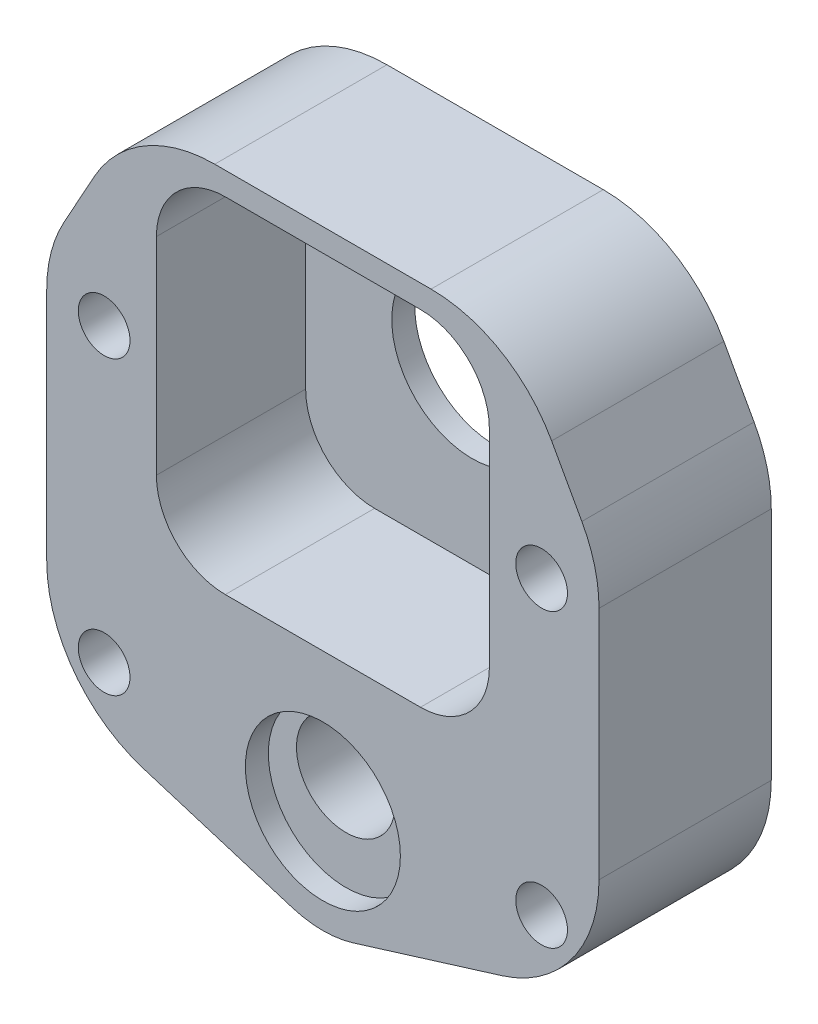
ISO-10303-21;
HEADER;
FILE_DESCRIPTION(('STEP AP214'),'2;1');
FILE_NAME('part.step','',(''),(''),'','','');
FILE_SCHEMA(('AUTOMOTIVE_DESIGN { 1 0 10303 214 1 1 1 1 }'));
ENDSEC;
DATA;
#1=APPLICATION_CONTEXT('core data for automotive mechanical design processes');
#2=APPLICATION_PROTOCOL_DEFINITION('international standard','automotive_design',2000,#1);
#3=PRODUCT_CONTEXT('',#1,'mechanical');
#4=PRODUCT('Part','Part','',(#3));
#5=PRODUCT_RELATED_PRODUCT_CATEGORY('part','',(#4));
#6=PRODUCT_DEFINITION_FORMATION('','',#4);
#7=PRODUCT_DEFINITION_CONTEXT('part definition',#1,'design');
#8=PRODUCT_DEFINITION('design','',#6,#7);
#9=PRODUCT_DEFINITION_SHAPE('','',#8);
#10=(LENGTH_UNIT() NAMED_UNIT(*) SI_UNIT(.MILLI.,.METRE.));
#11=(NAMED_UNIT(*) PLANE_ANGLE_UNIT() SI_UNIT($,.RADIAN.));
#12=(NAMED_UNIT(*) SI_UNIT($,.STERADIAN.) SOLID_ANGLE_UNIT());
#13=UNCERTAINTY_MEASURE_WITH_UNIT(LENGTH_MEASURE(1.E-05),#10,'distance_accuracy_value','');
#14=(GEOMETRIC_REPRESENTATION_CONTEXT(3) GLOBAL_UNCERTAINTY_ASSIGNED_CONTEXT((#13)) GLOBAL_UNIT_ASSIGNED_CONTEXT((#10,
#11,#12)) REPRESENTATION_CONTEXT('',''));
#15=CARTESIAN_POINT('',(0.,0.,0.));
#16=DIRECTION('',(0.,0.,1.));
#17=DIRECTION('',(1.,0.,0.));
#18=AXIS2_PLACEMENT_3D('',#15,#16,#17);
#19=CARTESIAN_POINT('',(0.,-25.4,15.));
#20=DIRECTION('',(0.,0.,-1.));
#21=DIRECTION('',(-1.,0.,0.));
#22=AXIS2_PLACEMENT_3D('',#19,#20,#21);
#23=CYLINDRICAL_SURFACE('',#22,4.3);
#24=CARTESIAN_POINT('',(0.,-25.4,0.));
#25=DIRECTION('',(0.,0.,1.));
#26=DIRECTION('',(1.,0.,0.));
#27=AXIS2_PLACEMENT_3D('',#24,#25,#26);
#28=CIRCLE('',#27,4.3);
#29=CARTESIAN_POINT('',(4.3,-25.4,0.));
#30=VERTEX_POINT('',#29);
#31=EDGE_CURVE('E213',#30,#30,#28,.T.);
#32=ORIENTED_EDGE('',*,*,#31,.F.);
#33=EDGE_LOOP('',(#32));
#34=FACE_BOUND('',#33,.T.);
#35=CARTESIAN_POINT('',(0.,-25.4,13.));
#36=DIRECTION('',(0.,0.,1.));
#37=DIRECTION('',(1.,0.,0.));
#38=AXIS2_PLACEMENT_3D('',#35,#36,#37);
#39=CIRCLE('',#38,4.3);
#40=CARTESIAN_POINT('',(4.3,-25.4,13.));
#41=VERTEX_POINT('',#40);
#42=EDGE_CURVE('E423',#41,#41,#39,.T.);
#43=ORIENTED_EDGE('',*,*,#42,.T.);
#44=EDGE_LOOP('',(#43));
#45=FACE_BOUND('',#44,.T.);
#46=ADVANCED_FACE('F47',(#34,#45),#23,.F.);
#47=CARTESIAN_POINT('',(0.,15.,15.));
#48=DIRECTION('',(0.,-1.,0.));
#49=DIRECTION('',(1.,0.,0.));
#50=AXIS2_PLACEMENT_3D('',#47,#48,#49);
#51=PLANE('',#50);
#52=DIRECTION('',(-1.,0.,0.));
#53=VECTOR('',#52,1.);
#54=CARTESIAN_POINT('',(0.,15.,15.));
#55=LINE('',#54,#53);
#56=CARTESIAN_POINT('',(8.49999999999999,15.,15.));
#57=VERTEX_POINT('',#56);
#58=CARTESIAN_POINT('',(-8.50000000000001,15.,15.));
#59=VERTEX_POINT('',#58);
#60=EDGE_CURVE('E490',#57,#59,#55,.T.);
#61=ORIENTED_EDGE('',*,*,#60,.T.);
#62=DIRECTION('',(0.,0.,-1.));
#63=VECTOR('',#62,1.);
#64=CARTESIAN_POINT('',(-8.50000000000001,15.,2.));
#65=LINE('',#64,#63);
#66=CARTESIAN_POINT('',(-8.50000000000001,15.,2.));
#67=VERTEX_POINT('',#66);
#68=EDGE_CURVE('E265',#59,#67,#65,.T.);
#69=ORIENTED_EDGE('',*,*,#68,.T.);
#70=DIRECTION('',(-1.,0.,0.));
#71=VECTOR('',#70,1.);
#72=CARTESIAN_POINT('',(0.,15.,2.));
#73=LINE('',#72,#71);
#74=CARTESIAN_POINT('',(8.49999999999999,15.,2.));
#75=VERTEX_POINT('',#74);
#76=EDGE_CURVE('E445',#75,#67,#73,.T.);
#77=ORIENTED_EDGE('',*,*,#76,.F.);
#78=DIRECTION('',(0.,0.,-1.));
#79=VECTOR('',#78,1.);
#80=CARTESIAN_POINT('',(8.49999999999999,15.,15.));
#81=LINE('',#80,#79);
#82=EDGE_CURVE('E262',#75,#57,#81,.F.);
#83=ORIENTED_EDGE('',*,*,#82,.T.);
#84=EDGE_LOOP('',(#61,#69,#77,#83));
#85=FACE_BOUND('',#84,.T.);
#86=ADVANCED_FACE('F419',(#85),#51,.T.);
#87=CARTESIAN_POINT('',(14.5,0.,15.));
#88=DIRECTION('',(1.,0.,0.));
#89=DIRECTION('',(0.,1.,0.));
#90=AXIS2_PLACEMENT_3D('',#87,#88,#89);
#91=PLANE('',#90);
#92=DIRECTION('',(0.,-1.,0.));
#93=VECTOR('',#92,1.);
#94=CARTESIAN_POINT('',(14.5,0.,15.));
#95=LINE('',#94,#93);
#96=CARTESIAN_POINT('',(14.5,9.,15.));
#97=VERTEX_POINT('',#96);
#98=CARTESIAN_POINT('',(14.5,-9.,15.));
#99=VERTEX_POINT('',#98);
#100=EDGE_CURVE('E494',#97,#99,#95,.T.);
#101=ORIENTED_EDGE('',*,*,#100,.F.);
#102=DIRECTION('',(0.,0.,-1.));
#103=VECTOR('',#102,1.);
#104=CARTESIAN_POINT('',(14.5,9.,15.));
#105=LINE('',#104,#103);
#106=CARTESIAN_POINT('',(14.5,9.,2.));
#107=VERTEX_POINT('',#106);
#108=EDGE_CURVE('E272',#97,#107,#105,.T.);
#109=ORIENTED_EDGE('',*,*,#108,.T.);
#110=DIRECTION('',(0.,-1.,0.));
#111=VECTOR('',#110,1.);
#112=CARTESIAN_POINT('',(14.5,0.,2.));
#113=LINE('',#112,#111);
#114=CARTESIAN_POINT('',(14.5,-9.,2.));
#115=VERTEX_POINT('',#114);
#116=EDGE_CURVE('E441',#107,#115,#113,.T.);
#117=ORIENTED_EDGE('',*,*,#116,.T.);
#118=DIRECTION('',(0.,0.,-1.));
#119=VECTOR('',#118,1.);
#120=CARTESIAN_POINT('',(14.5,-9.,15.));
#121=LINE('',#120,#119);
#122=EDGE_CURVE('E269',#115,#99,#121,.F.);
#123=ORIENTED_EDGE('',*,*,#122,.T.);
#124=EDGE_LOOP('',(#101,#109,#117,#123));
#125=FACE_BOUND('',#124,.T.);
#126=ADVANCED_FACE('F604',(#125),#91,.F.);
#127=CARTESIAN_POINT('',(0.,-15.,15.));
#128=DIRECTION('',(0.,-1.,0.));
#129=DIRECTION('',(1.,0.,0.));
#130=AXIS2_PLACEMENT_3D('',#127,#128,#129);
#131=PLANE('',#130);
#132=DIRECTION('',(-1.,0.,0.));
#133=VECTOR('',#132,1.);
#134=CARTESIAN_POINT('',(0.,-15.,2.));
#135=LINE('',#134,#133);
#136=CARTESIAN_POINT('',(8.5,-15.,2.));
#137=VERTEX_POINT('',#136);
#138=CARTESIAN_POINT('',(-8.5,-15.,2.));
#139=VERTEX_POINT('',#138);
#140=EDGE_CURVE('E453',#137,#139,#135,.T.);
#141=ORIENTED_EDGE('',*,*,#140,.T.);
#142=DIRECTION('',(0.,0.,-1.));
#143=VECTOR('',#142,1.);
#144=CARTESIAN_POINT('',(-8.5,-15.,15.));
#145=LINE('',#144,#143);
#146=CARTESIAN_POINT('',(-8.5,-15.,15.));
#147=VERTEX_POINT('',#146);
#148=EDGE_CURVE('E259',#139,#147,#145,.F.);
#149=ORIENTED_EDGE('',*,*,#148,.T.);
#150=DIRECTION('',(-1.,0.,0.));
#151=VECTOR('',#150,1.);
#152=CARTESIAN_POINT('',(0.,-15.,15.));
#153=LINE('',#152,#151);
#154=CARTESIAN_POINT('',(8.5,-15.,15.));
#155=VERTEX_POINT('',#154);
#156=EDGE_CURVE('E498',#155,#147,#153,.T.);
#157=ORIENTED_EDGE('',*,*,#156,.F.);
#158=DIRECTION('',(0.,0.,-1.));
#159=VECTOR('',#158,1.);
#160=CARTESIAN_POINT('',(8.5,-15.,2.));
#161=LINE('',#160,#159);
#162=EDGE_CURVE('E255',#155,#137,#161,.T.);
#163=ORIENTED_EDGE('',*,*,#162,.T.);
#164=EDGE_LOOP('',(#141,#149,#157,#163));
#165=FACE_BOUND('',#164,.T.);
#166=ADVANCED_FACE('F565',(#165),#131,.F.);
#167=CARTESIAN_POINT('',(-10.3013341487566,-33.3366902143089,15.));
#168=DIRECTION('',(0.295234753991785,0.955424743261033,0.));
#169=DIRECTION('',(-0.955424743261033,0.295234753991785,0.));
#170=AXIS2_PLACEMENT_3D('',#167,#168,#169);
#171=PLANE('',#170);
#172=DIRECTION('',(0.955424743261033,-0.295234753991785,0.));
#173=VECTOR('',#172,1.);
#174=CARTESIAN_POINT('',(-10.3013341487566,-33.3366902143089,15.));
#175=LINE('',#174,#173);
#176=CARTESIAN_POINT('',(-15.5928170479014,-31.7015748763404,15.));
#177=VERTEX_POINT('',#176);
#178=CARTESIAN_POINT('',(-2.65711278592607,-35.6988226893493,15.));
#179=VERTEX_POINT('',#178);
#180=EDGE_CURVE('E198',#177,#179,#175,.T.);
#181=ORIENTED_EDGE('',*,*,#180,.F.);
#182=DIRECTION('',(0.,0.,-1.));
#183=VECTOR('',#182,1.);
#184=CARTESIAN_POINT('',(-15.5928170479014,-31.7015748763404,15.));
#185=LINE('',#184,#183);
#186=CARTESIAN_POINT('',(-15.5928170479014,-31.7015748763404,0.));
#187=VERTEX_POINT('',#186);
#188=EDGE_CURVE('E339',#177,#187,#185,.T.);
#189=ORIENTED_EDGE('',*,*,#188,.T.);
#190=DIRECTION('',(0.955424743261033,-0.295234753991785,0.));
#191=VECTOR('',#190,1.);
#192=CARTESIAN_POINT('',(-10.3013341487566,-33.3366902143089,0.));
#193=LINE('',#192,#191);
#194=CARTESIAN_POINT('',(-2.65711278592607,-35.6988226893493,0.));
#195=VERTEX_POINT('',#194);
#196=EDGE_CURVE('E227',#187,#195,#193,.T.);
#197=ORIENTED_EDGE('',*,*,#196,.T.);
#198=DIRECTION('',(0.,0.,-1.));
#199=VECTOR('',#198,1.);
#200=CARTESIAN_POINT('',(-2.65711278592607,-35.6988226893493,15.));
#201=LINE('',#200,#199);
#202=EDGE_CURVE('E219',#179,#195,#201,.T.);
#203=ORIENTED_EDGE('',*,*,#202,.F.);
#204=EDGE_LOOP('',(#181,#189,#197,#203));
#205=FACE_BOUND('',#204,.T.);
#206=ADVANCED_FACE('F225',(#205),#171,.F.);
#207=CARTESIAN_POINT('',(0.,-27.1,15.));
#208=DIRECTION('',(0.,0.,-1.));
#209=DIRECTION('',(-1.,0.,0.));
#210=AXIS2_PLACEMENT_3D('',#207,#208,#209);
#211=CYLINDRICAL_SURFACE('',#210,9.);
#212=CARTESIAN_POINT('',(0.,-27.1,0.));
#213=DIRECTION('',(0.,0.,1.));
#214=DIRECTION('',(1.,0.,0.));
#215=AXIS2_PLACEMENT_3D('',#212,#213,#214);
#216=CIRCLE('',#215,9.);
#217=CARTESIAN_POINT('',(2.65711278592618,-35.6988226893493,0.));
#218=VERTEX_POINT('',#217);
#219=EDGE_CURVE('E507',#195,#218,#216,.T.);
#220=ORIENTED_EDGE('',*,*,#219,.T.);
#221=DIRECTION('',(0.,0.,-1.));
#222=VECTOR('',#221,1.);
#223=CARTESIAN_POINT('',(2.65711278592618,-35.6988226893493,15.));
#224=LINE('',#223,#222);
#225=CARTESIAN_POINT('',(2.65711278592618,-35.6988226893493,15.));
#226=VERTEX_POINT('',#225);
#227=EDGE_CURVE('E221',#226,#218,#224,.T.);
#228=ORIENTED_EDGE('',*,*,#227,.F.);
#229=CARTESIAN_POINT('',(0.,-27.1,15.));
#230=DIRECTION('',(0.,0.,1.));
#231=DIRECTION('',(1.,0.,0.));
#232=AXIS2_PLACEMENT_3D('',#229,#230,#231);
#233=CIRCLE('',#232,9.);
#234=EDGE_CURVE('E204',#179,#226,#233,.T.);
#235=ORIENTED_EDGE('',*,*,#234,.F.);
#236=ORIENTED_EDGE('',*,*,#202,.T.);
#237=EDGE_LOOP('',(#220,#228,#235,#236));
#238=FACE_BOUND('',#237,.T.);
#239=ADVANCED_FACE('F218',(#238),#211,.T.);
#240=CARTESIAN_POINT('',(10.301334148757,-33.3366902143087,15.));
#241=DIRECTION('',(0.295234753991798,-0.955424743261029,0.));
#242=DIRECTION('',(0.955424743261029,0.295234753991798,0.));
#243=AXIS2_PLACEMENT_3D('',#240,#241,#242);
#244=PLANE('',#243);
#245=DIRECTION('',(-0.955424743261029,-0.295234753991798,0.));
#246=VECTOR('',#245,1.);
#247=CARTESIAN_POINT('',(10.301334148757,-33.3366902143087,0.));
#248=LINE('',#247,#246);
#249=CARTESIAN_POINT('',(15.5928170479016,-31.7015748763401,0.));
#250=VERTEX_POINT('',#249);
#251=EDGE_CURVE('E510',#250,#218,#248,.T.);
#252=ORIENTED_EDGE('',*,*,#251,.F.);
#253=DIRECTION('',(0.,0.,-1.));
#254=VECTOR('',#253,1.);
#255=CARTESIAN_POINT('',(15.5928170479016,-31.7015748763401,15.));
#256=LINE('',#255,#254);
#257=CARTESIAN_POINT('',(15.5928170479016,-31.7015748763401,15.));
#258=VERTEX_POINT('',#257);
#259=EDGE_CURVE('E336',#250,#258,#256,.F.);
#260=ORIENTED_EDGE('',*,*,#259,.T.);
#261=DIRECTION('',(-0.955424743261029,-0.295234753991798,0.));
#262=VECTOR('',#261,1.);
#263=CARTESIAN_POINT('',(10.301334148757,-33.3366902143087,15.));
#264=LINE('',#263,#262);
#265=EDGE_CURVE('E223',#258,#226,#264,.T.);
#266=ORIENTED_EDGE('',*,*,#265,.T.);
#267=ORIENTED_EDGE('',*,*,#227,.T.);
#268=EDGE_LOOP('',(#252,#260,#266,#267));
#269=FACE_BOUND('',#268,.T.);
#270=ADVANCED_FACE('F568',(#269),#244,.T.);
#271=CARTESIAN_POINT('',(24.05,0.,15.));
#272=DIRECTION('',(1.,0.,0.));
#273=DIRECTION('',(0.,1.,0.));
#274=AXIS2_PLACEMENT_3D('',#271,#272,#273);
#275=PLANE('',#274);
#276=DIRECTION('',(0.,-1.,0.));
#277=VECTOR('',#276,1.);
#278=CARTESIAN_POINT('',(24.05,0.,0.));
#279=LINE('',#278,#277);
#280=CARTESIAN_POINT('',(24.05,0.239084913491565,0.));
#281=VERTEX_POINT('',#280);
#282=CARTESIAN_POINT('',(24.05,-20.2364779572078,0.));
#283=VERTEX_POINT('',#282);
#284=EDGE_CURVE('E513',#281,#283,#279,.T.);
#285=ORIENTED_EDGE('',*,*,#284,.F.);
#286=DIRECTION('',(0.,0.,-1.));
#287=VECTOR('',#286,1.);
#288=CARTESIAN_POINT('',(24.05,0.239084913491565,15.));
#289=LINE('',#288,#287);
#290=CARTESIAN_POINT('',(24.05,0.239084913491565,15.));
#291=VERTEX_POINT('',#290);
#292=EDGE_CURVE('E317',#281,#291,#289,.F.);
#293=ORIENTED_EDGE('',*,*,#292,.T.);
#294=DIRECTION('',(0.,-1.,0.));
#295=VECTOR('',#294,1.);
#296=CARTESIAN_POINT('',(24.05,0.,15.));
#297=LINE('',#296,#295);
#298=CARTESIAN_POINT('',(24.05,-20.2364779572078,15.));
#299=VERTEX_POINT('',#298);
#300=EDGE_CURVE('E462',#291,#299,#297,.T.);
#301=ORIENTED_EDGE('',*,*,#300,.T.);
#302=DIRECTION('',(0.,0.,-1.));
#303=VECTOR('',#302,1.);
#304=CARTESIAN_POINT('',(24.05,-20.2364779572078,15.));
#305=LINE('',#304,#303);
#306=EDGE_CURVE('E313',#299,#283,#305,.T.);
#307=ORIENTED_EDGE('',*,*,#306,.T.);
#308=EDGE_LOOP('',(#285,#293,#301,#307));
#309=FACE_BOUND('',#308,.T.);
#310=ADVANCED_FACE('F571',(#309),#275,.T.);
#311=CARTESIAN_POINT('',(19.8373307475197,10.9589156446664,15.));
#312=DIRECTION('',(0.875312878327595,0.483556992539515,0.));
#313=DIRECTION('',(-0.483556992539515,0.875312878327595,0.));
#314=AXIS2_PLACEMENT_3D('',#311,#312,#313);
#315=PLANE('',#314);
#316=DIRECTION('',(0.483556992539515,-0.875312878327595,0.));
#317=VECTOR('',#316,1.);
#318=CARTESIAN_POINT('',(19.8373307475197,10.9589156446664,15.));
#319=LINE('',#318,#317);
#320=CARTESIAN_POINT('',(19.9236392543356,10.8026839104742,15.));
#321=VERTEX_POINT('',#320);
#322=CARTESIAN_POINT('',(22.5537545399311,6.04176882396574,15.));
#323=VERTEX_POINT('',#322);
#324=EDGE_CURVE('E372',#321,#323,#319,.T.);
#325=ORIENTED_EDGE('',*,*,#324,.T.);
#326=DIRECTION('',(0.,0.,-1.));
#327=VECTOR('',#326,1.);
#328=CARTESIAN_POINT('',(22.5537545399311,6.04176882396574,15.));
#329=LINE('',#328,#327);
#330=CARTESIAN_POINT('',(22.5537545399311,6.04176882396574,0.));
#331=VERTEX_POINT('',#330);
#332=EDGE_CURVE('E291',#323,#331,#329,.T.);
#333=ORIENTED_EDGE('',*,*,#332,.T.);
#334=DIRECTION('',(0.483556992539515,-0.875312878327595,0.));
#335=VECTOR('',#334,1.);
#336=CARTESIAN_POINT('',(19.8373307475197,10.9589156446664,0.));
#337=LINE('',#336,#335);
#338=CARTESIAN_POINT('',(19.9236392543356,10.8026839104742,0.));
#339=VERTEX_POINT('',#338);
#340=EDGE_CURVE('E393',#339,#331,#337,.T.);
#341=ORIENTED_EDGE('',*,*,#340,.F.);
#342=DIRECTION('',(0.,0.,-1.));
#343=VECTOR('',#342,1.);
#344=CARTESIAN_POINT('',(19.9236392543356,10.8026839104742,15.));
#345=LINE('',#344,#343);
#346=EDGE_CURVE('E288',#339,#321,#345,.F.);
#347=ORIENTED_EDGE('',*,*,#346,.T.);
#348=EDGE_LOOP('',(#325,#333,#341,#347));
#349=FACE_BOUND('',#348,.T.);
#350=ADVANCED_FACE('F521',(#349),#315,.T.);
#351=CARTESIAN_POINT('',(0.,17.,15.));
#352=DIRECTION('',(0.,1.,0.));
#353=DIRECTION('',(0.,0.,1.));
#354=AXIS2_PLACEMENT_3D('',#351,#352,#353);
#355=PLANE('',#354);
#356=DIRECTION('',(1.,0.,0.));
#357=VECTOR('',#356,1.);
#358=CARTESIAN_POINT('',(0.,17.,15.));
#359=LINE('',#358,#357);
#360=CARTESIAN_POINT('',(-9.41988471440439,17.,15.));
#361=VERTEX_POINT('',#360);
#362=CARTESIAN_POINT('',(9.41988471440447,17.,15.));
#363=VERTEX_POINT('',#362);
#364=EDGE_CURVE('E361',#361,#363,#359,.T.);
#365=ORIENTED_EDGE('',*,*,#364,.T.);
#366=DIRECTION('',(0.,0.,-1.));
#367=VECTOR('',#366,1.);
#368=CARTESIAN_POINT('',(9.41988471440447,17.,15.));
#369=LINE('',#368,#367);
#370=CARTESIAN_POINT('',(9.41988471440447,17.,0.));
#371=VERTEX_POINT('',#370);
#372=EDGE_CURVE('E12',#363,#371,#369,.T.);
#373=ORIENTED_EDGE('',*,*,#372,.T.);
#374=DIRECTION('',(1.,0.,0.));
#375=VECTOR('',#374,1.);
#376=CARTESIAN_POINT('',(0.,17.,0.));
#377=LINE('',#376,#375);
#378=CARTESIAN_POINT('',(-9.41988471440439,17.,0.));
#379=VERTEX_POINT('',#378);
#380=EDGE_CURVE('E364',#379,#371,#377,.T.);
#381=ORIENTED_EDGE('',*,*,#380,.F.);
#382=DIRECTION('',(0.,0.,-1.));
#383=VECTOR('',#382,1.);
#384=CARTESIAN_POINT('',(-9.41988471440439,17.,15.));
#385=LINE('',#384,#383);
#386=EDGE_CURVE('E56',#379,#361,#385,.F.);
#387=ORIENTED_EDGE('',*,*,#386,.T.);
#388=EDGE_LOOP('',(#365,#373,#381,#387));
#389=FACE_BOUND('',#388,.T.);
#390=ADVANCED_FACE('F360',(#389),#355,.T.);
#391=CARTESIAN_POINT('',(-19.8373307475197,10.9589156446661,15.));
#392=DIRECTION('',(0.875312878327601,-0.483556992539505,0.));
#393=DIRECTION('',(0.483556992539505,0.875312878327601,0.));
#394=AXIS2_PLACEMENT_3D('',#391,#392,#393);
#395=PLANE('',#394);
#396=DIRECTION('',(-0.483556992539505,-0.875312878327601,0.));
#397=VECTOR('',#396,1.);
#398=CARTESIAN_POINT('',(-19.8373307475197,10.9589156446661,0.));
#399=LINE('',#398,#397);
#400=CARTESIAN_POINT('',(-19.9236392543356,10.8026839104741,0.));
#401=VERTEX_POINT('',#400);
#402=CARTESIAN_POINT('',(-22.5537545399312,6.04176882396533,0.));
#403=VERTEX_POINT('',#402);
#404=EDGE_CURVE('E379',#401,#403,#399,.T.);
#405=ORIENTED_EDGE('',*,*,#404,.T.);
#406=DIRECTION('',(0.,0.,-1.));
#407=VECTOR('',#406,1.);
#408=CARTESIAN_POINT('',(-22.5537545399312,6.04176882396533,15.));
#409=LINE('',#408,#407);
#410=CARTESIAN_POINT('',(-22.5537545399312,6.04176882396533,15.));
#411=VERTEX_POINT('',#410);
#412=EDGE_CURVE('E352',#403,#411,#409,.F.);
#413=ORIENTED_EDGE('',*,*,#412,.T.);
#414=DIRECTION('',(-0.483556992539505,-0.875312878327601,0.));
#415=VECTOR('',#414,1.);
#416=CARTESIAN_POINT('',(-19.8373307475197,10.9589156446661,15.));
#417=LINE('',#416,#415);
#418=CARTESIAN_POINT('',(-19.9236392543356,10.8026839104741,15.));
#419=VERTEX_POINT('',#418);
#420=EDGE_CURVE('E371',#419,#411,#417,.T.);
#421=ORIENTED_EDGE('',*,*,#420,.F.);
#422=DIRECTION('',(0.,0.,-1.));
#423=VECTOR('',#422,1.);
#424=CARTESIAN_POINT('',(-19.9236392543356,10.8026839104741,0.));
#425=LINE('',#424,#423);
#426=EDGE_CURVE('E348',#419,#401,#425,.T.);
#427=ORIENTED_EDGE('',*,*,#426,.T.);
#428=EDGE_LOOP('',(#405,#413,#421,#427));
#429=FACE_BOUND('',#428,.T.);
#430=ADVANCED_FACE('F378',(#429),#395,.F.);
#431=CARTESIAN_POINT('',(-14.5,0.,15.));
#432=DIRECTION('',(1.,0.,0.));
#433=DIRECTION('',(0.,1.,0.));
#434=AXIS2_PLACEMENT_3D('',#431,#432,#433);
#435=PLANE('',#434);
#436=DIRECTION('',(0.,-1.,0.));
#437=VECTOR('',#436,1.);
#438=CARTESIAN_POINT('',(-14.5,0.,15.));
#439=LINE('',#438,#437);
#440=CARTESIAN_POINT('',(-14.5,9.,15.));
#441=VERTEX_POINT('',#440);
#442=CARTESIAN_POINT('',(-14.5,-9.00000000000001,15.));
#443=VERTEX_POINT('',#442);
#444=EDGE_CURVE('E236',#441,#443,#439,.T.);
#445=ORIENTED_EDGE('',*,*,#444,.T.);
#446=DIRECTION('',(0.,0.,-1.));
#447=VECTOR('',#446,1.);
#448=CARTESIAN_POINT('',(-14.5,-9.00000000000001,15.));
#449=LINE('',#448,#447);
#450=CARTESIAN_POINT('',(-14.5,-9.00000000000001,2.));
#451=VERTEX_POINT('',#450);
#452=EDGE_CURVE('E234',#443,#451,#449,.T.);
#453=ORIENTED_EDGE('',*,*,#452,.T.);
#454=DIRECTION('',(0.,-1.,0.));
#455=VECTOR('',#454,1.);
#456=CARTESIAN_POINT('',(-14.5,0.,2.));
#457=LINE('',#456,#455);
#458=CARTESIAN_POINT('',(-14.5,9.,2.));
#459=VERTEX_POINT('',#458);
#460=EDGE_CURVE('E449',#459,#451,#457,.T.);
#461=ORIENTED_EDGE('',*,*,#460,.F.);
#462=DIRECTION('',(0.,0.,-1.));
#463=VECTOR('',#462,1.);
#464=CARTESIAN_POINT('',(-14.5,9.,15.));
#465=LINE('',#464,#463);
#466=EDGE_CURVE('E230',#459,#441,#465,.F.);
#467=ORIENTED_EDGE('',*,*,#466,.T.);
#468=EDGE_LOOP('',(#445,#453,#461,#467));
#469=FACE_BOUND('',#468,.T.);
#470=ADVANCED_FACE('F582',(#469),#435,.T.);
#471=CARTESIAN_POINT('',(19.05,0.,15.));
#472=DIRECTION('',(0.,0.,-1.));
#473=DIRECTION('',(-1.,0.,0.));
#474=AXIS2_PLACEMENT_3D('',#471,#472,#473);
#475=CYLINDRICAL_SURFACE('',#474,2.25);
#476=CARTESIAN_POINT('',(19.05,0.,15.));
#477=DIRECTION('',(0.,0.,1.));
#478=DIRECTION('',(1.,0.,0.));
#479=AXIS2_PLACEMENT_3D('',#476,#477,#478);
#480=CIRCLE('',#479,2.25);
#481=CARTESIAN_POINT('',(21.3,0.,15.));
#482=VERTEX_POINT('',#481);
#483=EDGE_CURVE('E486',#482,#482,#480,.T.);
#484=ORIENTED_EDGE('',*,*,#483,.T.);
#485=EDGE_LOOP('',(#484));
#486=FACE_BOUND('',#485,.T.);
#487=CARTESIAN_POINT('',(19.05,0.,0.));
#488=DIRECTION('',(0.,0.,1.));
#489=DIRECTION('',(1.,0.,0.));
#490=AXIS2_PLACEMENT_3D('',#487,#488,#489);
#491=CIRCLE('',#490,2.25);
#492=CARTESIAN_POINT('',(21.3,0.,0.));
#493=VERTEX_POINT('',#492);
#494=EDGE_CURVE('E408',#493,#493,#491,.T.);
#495=ORIENTED_EDGE('',*,*,#494,.F.);
#496=EDGE_LOOP('',(#495));
#497=FACE_BOUND('',#496,.T.);
#498=ADVANCED_FACE('F597',(#486,#497),#475,.F.);
#499=CARTESIAN_POINT('',(-19.05,-2.66050878019847E-13,15.));
#500=DIRECTION('',(0.,0.,-1.));
#501=DIRECTION('',(-1.,0.,0.));
#502=AXIS2_PLACEMENT_3D('',#499,#500,#501);
#503=CYLINDRICAL_SURFACE('',#502,2.25);
#504=CARTESIAN_POINT('',(-19.05,-2.66050878019847E-13,15.));
#505=DIRECTION('',(0.,0.,1.));
#506=DIRECTION('',(1.,0.,0.));
#507=AXIS2_PLACEMENT_3D('',#504,#505,#506);
#508=CIRCLE('',#507,2.25);
#509=CARTESIAN_POINT('',(-16.8,-2.66050878019847E-13,15.));
#510=VERTEX_POINT('',#509);
#511=EDGE_CURVE('E482',#510,#510,#508,.T.);
#512=ORIENTED_EDGE('',*,*,#511,.T.);
#513=EDGE_LOOP('',(#512));
#514=FACE_BOUND('',#513,.T.);
#515=CARTESIAN_POINT('',(-19.05,-2.66050878019847E-13,0.));
#516=DIRECTION('',(0.,0.,1.));
#517=DIRECTION('',(1.,0.,0.));
#518=AXIS2_PLACEMENT_3D('',#515,#516,#517);
#519=CIRCLE('',#518,2.25);
#520=CARTESIAN_POINT('',(-16.8,-2.66050878019847E-13,0.));
#521=VERTEX_POINT('',#520);
#522=EDGE_CURVE('E404',#521,#521,#519,.T.);
#523=ORIENTED_EDGE('',*,*,#522,.F.);
#524=EDGE_LOOP('',(#523));
#525=FACE_BOUND('',#524,.T.);
#526=ADVANCED_FACE('F593',(#514,#525),#503,.F.);
#527=CARTESIAN_POINT('',(-19.05,-25.4000000000003,15.));
#528=DIRECTION('',(0.,0.,-1.));
#529=DIRECTION('',(-1.,0.,0.));
#530=AXIS2_PLACEMENT_3D('',#527,#528,#529);
#531=CYLINDRICAL_SURFACE('',#530,2.25);
#532=CARTESIAN_POINT('',(-19.05,-25.4000000000003,15.));
#533=DIRECTION('',(0.,0.,1.));
#534=DIRECTION('',(1.,0.,0.));
#535=AXIS2_PLACEMENT_3D('',#532,#533,#534);
#536=CIRCLE('',#535,2.25);
#537=CARTESIAN_POINT('',(-16.8,-25.4000000000003,15.));
#538=VERTEX_POINT('',#537);
#539=EDGE_CURVE('E478',#538,#538,#536,.T.);
#540=ORIENTED_EDGE('',*,*,#539,.T.);
#541=EDGE_LOOP('',(#540));
#542=FACE_BOUND('',#541,.T.);
#543=CARTESIAN_POINT('',(-19.05,-25.4000000000003,0.));
#544=DIRECTION('',(0.,0.,1.));
#545=DIRECTION('',(1.,0.,0.));
#546=AXIS2_PLACEMENT_3D('',#543,#544,#545);
#547=CIRCLE('',#546,2.25);
#548=CARTESIAN_POINT('',(-16.8,-25.4000000000003,0.));
#549=VERTEX_POINT('',#548);
#550=EDGE_CURVE('E400',#549,#549,#547,.T.);
#551=ORIENTED_EDGE('',*,*,#550,.F.);
#552=EDGE_LOOP('',(#551));
#553=FACE_BOUND('',#552,.T.);
#554=ADVANCED_FACE('F589',(#542,#553),#531,.F.);
#555=CARTESIAN_POINT('',(19.05,-25.4,15.));
#556=DIRECTION('',(0.,0.,-1.));
#557=DIRECTION('',(-1.,0.,0.));
#558=AXIS2_PLACEMENT_3D('',#555,#556,#557);
#559=CYLINDRICAL_SURFACE('',#558,2.25);
#560=CARTESIAN_POINT('',(19.05,-25.4,15.));
#561=DIRECTION('',(0.,0.,1.));
#562=DIRECTION('',(1.,0.,0.));
#563=AXIS2_PLACEMENT_3D('',#560,#561,#562);
#564=CIRCLE('',#563,2.25);
#565=CARTESIAN_POINT('',(21.3,-25.4,15.));
#566=VERTEX_POINT('',#565);
#567=EDGE_CURVE('E474',#566,#566,#564,.T.);
#568=ORIENTED_EDGE('',*,*,#567,.T.);
#569=EDGE_LOOP('',(#568));
#570=FACE_BOUND('',#569,.T.);
#571=CARTESIAN_POINT('',(19.05,-25.4,0.));
#572=DIRECTION('',(0.,0.,1.));
#573=DIRECTION('',(1.,0.,0.));
#574=AXIS2_PLACEMENT_3D('',#571,#572,#573);
#575=CIRCLE('',#574,2.25);
#576=CARTESIAN_POINT('',(21.3,-25.4,0.));
#577=VERTEX_POINT('',#576);
#578=EDGE_CURVE('E391',#577,#577,#575,.T.);
#579=ORIENTED_EDGE('',*,*,#578,.F.);
#580=EDGE_LOOP('',(#579));
#581=FACE_BOUND('',#580,.T.);
#582=ADVANCED_FACE('F586',(#570,#581),#559,.F.);
#583=CARTESIAN_POINT('',(-24.05,0.,15.));
#584=DIRECTION('',(1.,0.,0.));
#585=DIRECTION('',(0.,1.,0.));
#586=AXIS2_PLACEMENT_3D('',#583,#584,#585);
#587=PLANE('',#586);
#588=DIRECTION('',(0.,-1.,0.));
#589=VECTOR('',#588,1.);
#590=CARTESIAN_POINT('',(-24.05,0.,0.));
#591=LINE('',#590,#589);
#592=CARTESIAN_POINT('',(-24.05,0.239084913491271,0.));
#593=VERTEX_POINT('',#592);
#594=CARTESIAN_POINT('',(-24.05,-20.236477957208,0.));
#595=VERTEX_POINT('',#594);
#596=EDGE_CURVE('E387',#593,#595,#591,.T.);
#597=ORIENTED_EDGE('',*,*,#596,.T.);
#598=DIRECTION('',(0.,0.,-1.));
#599=VECTOR('',#598,1.);
#600=CARTESIAN_POINT('',(-24.05,-20.236477957208,15.));
#601=LINE('',#600,#599);
#602=CARTESIAN_POINT('',(-24.05,-20.236477957208,15.));
#603=VERTEX_POINT('',#602);
#604=EDGE_CURVE('E63',#595,#603,#601,.F.);
#605=ORIENTED_EDGE('',*,*,#604,.T.);
#606=DIRECTION('',(0.,-1.,0.));
#607=VECTOR('',#606,1.);
#608=CARTESIAN_POINT('',(-24.05,0.,15.));
#609=LINE('',#608,#607);
#610=CARTESIAN_POINT('',(-24.05,0.239084913491271,15.));
#611=VERTEX_POINT('',#610);
#612=EDGE_CURVE('E471',#611,#603,#609,.T.);
#613=ORIENTED_EDGE('',*,*,#612,.F.);
#614=DIRECTION('',(0.,0.,-1.));
#615=VECTOR('',#614,1.);
#616=CARTESIAN_POINT('',(-24.05,0.239084913491271,15.));
#617=LINE('',#616,#615);
#618=EDGE_CURVE('E342',#611,#593,#617,.T.);
#619=ORIENTED_EDGE('',*,*,#618,.T.);
#620=EDGE_LOOP('',(#597,#605,#613,#619));
#621=FACE_BOUND('',#620,.T.);
#622=ADVANCED_FACE('F583',(#621),#587,.F.);
#623=CARTESIAN_POINT('',(0.,0.,15.));
#624=DIRECTION('',(0.,0.,1.));
#625=DIRECTION('',(1.,0.,0.));
#626=AXIS2_PLACEMENT_3D('',#623,#624,#625);
#627=PLANE('',#626);
#628=CARTESIAN_POINT('',(0.,-27.1,15.));
#629=DIRECTION('',(0.,0.,1.));
#630=DIRECTION('',(1.,0.,0.));
#631=AXIS2_PLACEMENT_3D('',#628,#629,#630);
#632=CIRCLE('',#631,6.75);
#633=CARTESIAN_POINT('',(6.75,-27.1,15.));
#634=VERTEX_POINT('',#633);
#635=EDGE_CURVE('E426',#634,#634,#632,.T.);
#636=ORIENTED_EDGE('',*,*,#635,.F.);
#637=EDGE_LOOP('',(#636));
#638=FACE_BOUND('',#637,.T.);
#639=ORIENTED_EDGE('',*,*,#300,.F.);
#640=CARTESIAN_POINT('',(12.05,0.239084913491562,15.));
#641=DIRECTION('',(0.,0.,1.));
#642=DIRECTION('',(1.,0.,0.));
#643=AXIS2_PLACEMENT_3D('',#640,#641,#642);
#644=CIRCLE('',#643,12.);
#645=EDGE_CURVE('E333',#291,#323,#644,.T.);
#646=ORIENTED_EDGE('',*,*,#645,.T.);
#647=ORIENTED_EDGE('',*,*,#324,.F.);
#648=CARTESIAN_POINT('',(9.41988471440447,5.,15.));
#649=DIRECTION('',(0.,0.,1.));
#650=DIRECTION('',(1.,0.,0.));
#651=AXIS2_PLACEMENT_3D('',#648,#649,#650);
#652=CIRCLE('',#651,12.);
#653=EDGE_CURVE('E323',#321,#363,#652,.T.);
#654=ORIENTED_EDGE('',*,*,#653,.T.);
#655=ORIENTED_EDGE('',*,*,#364,.F.);
#656=CARTESIAN_POINT('',(-9.41988471440439,5.,15.));
#657=DIRECTION('',(0.,0.,1.));
#658=DIRECTION('',(1.,0.,0.));
#659=AXIS2_PLACEMENT_3D('',#656,#657,#658);
#660=CIRCLE('',#659,12.);
#661=EDGE_CURVE('E320',#361,#419,#660,.T.);
#662=ORIENTED_EDGE('',*,*,#661,.T.);
#663=ORIENTED_EDGE('',*,*,#420,.T.);
#664=CARTESIAN_POINT('',(-12.05,0.239084913491273,15.));
#665=DIRECTION('',(0.,0.,1.));
#666=DIRECTION('',(1.,0.,0.));
#667=AXIS2_PLACEMENT_3D('',#664,#665,#666);
#668=CIRCLE('',#667,12.);
#669=EDGE_CURVE('E70',#411,#611,#668,.T.);
#670=ORIENTED_EDGE('',*,*,#669,.T.);
#671=ORIENTED_EDGE('',*,*,#612,.T.);
#672=CARTESIAN_POINT('',(-12.05,-20.236477957208,15.));
#673=DIRECTION('',(0.,0.,1.));
#674=DIRECTION('',(1.,0.,0.));
#675=AXIS2_PLACEMENT_3D('',#672,#673,#674);
#676=CIRCLE('',#675,12.);
#677=EDGE_CURVE('E207',#603,#177,#676,.T.);
#678=ORIENTED_EDGE('',*,*,#677,.T.);
#679=ORIENTED_EDGE('',*,*,#180,.T.);
#680=ORIENTED_EDGE('',*,*,#234,.T.);
#681=ORIENTED_EDGE('',*,*,#265,.F.);
#682=CARTESIAN_POINT('',(12.05,-20.2364779572078,15.));
#683=DIRECTION('',(0.,0.,1.));
#684=DIRECTION('',(1.,0.,0.));
#685=AXIS2_PLACEMENT_3D('',#682,#683,#684);
#686=CIRCLE('',#685,12.);
#687=EDGE_CURVE('E330',#258,#299,#686,.T.);
#688=ORIENTED_EDGE('',*,*,#687,.T.);
#689=EDGE_LOOP('',(#639,#646,#647,#654,#655,#662,#663,#670,#671,#678,#679,#680,#681,#688));
#690=FACE_BOUND('',#689,.T.);
#691=ORIENTED_EDGE('',*,*,#567,.F.);
#692=EDGE_LOOP('',(#691));
#693=FACE_BOUND('',#692,.T.);
#694=ORIENTED_EDGE('',*,*,#539,.F.);
#695=EDGE_LOOP('',(#694));
#696=FACE_BOUND('',#695,.T.);
#697=ORIENTED_EDGE('',*,*,#511,.F.);
#698=EDGE_LOOP('',(#697));
#699=FACE_BOUND('',#698,.T.);
#700=ORIENTED_EDGE('',*,*,#483,.F.);
#701=EDGE_LOOP('',(#700));
#702=FACE_BOUND('',#701,.T.);
#703=ORIENTED_EDGE('',*,*,#60,.F.);
#704=CARTESIAN_POINT('',(8.49999999999999,9.,15.));
#705=DIRECTION('',(0.,0.,1.));
#706=DIRECTION('',(1.,0.,0.));
#707=AXIS2_PLACEMENT_3D('',#704,#705,#706);
#708=CIRCLE('',#707,6.);
#709=EDGE_CURVE('E282',#57,#97,#708,.F.);
#710=ORIENTED_EDGE('',*,*,#709,.T.);
#711=ORIENTED_EDGE('',*,*,#100,.T.);
#712=CARTESIAN_POINT('',(8.5,-9.,15.));
#713=DIRECTION('',(0.,0.,1.));
#714=DIRECTION('',(1.,0.,0.));
#715=AXIS2_PLACEMENT_3D('',#712,#713,#714);
#716=CIRCLE('',#715,6.);
#717=EDGE_CURVE('E285',#99,#155,#716,.F.);
#718=ORIENTED_EDGE('',*,*,#717,.T.);
#719=ORIENTED_EDGE('',*,*,#156,.T.);
#720=CARTESIAN_POINT('',(-8.5,-9.00000000000001,15.));
#721=DIRECTION('',(0.,0.,1.));
#722=DIRECTION('',(1.,0.,0.));
#723=AXIS2_PLACEMENT_3D('',#720,#721,#722);
#724=CIRCLE('',#723,6.);
#725=EDGE_CURVE('E276',#147,#443,#724,.F.);
#726=ORIENTED_EDGE('',*,*,#725,.T.);
#727=ORIENTED_EDGE('',*,*,#444,.F.);
#728=CARTESIAN_POINT('',(-8.50000000000001,9.,15.));
#729=DIRECTION('',(0.,0.,1.));
#730=DIRECTION('',(1.,0.,0.));
#731=AXIS2_PLACEMENT_3D('',#728,#729,#730);
#732=CIRCLE('',#731,6.);
#733=EDGE_CURVE('E279',#441,#59,#732,.F.);
#734=ORIENTED_EDGE('',*,*,#733,.T.);
#735=EDGE_LOOP('',(#703,#710,#711,#718,#719,#726,#727,#734));
#736=FACE_BOUND('',#735,.T.);
#737=ADVANCED_FACE('F201',(#638,#690,#693,#696,#699,#702,#736),#627,.T.);
#738=CARTESIAN_POINT('',(0.,0.,0.));
#739=DIRECTION('',(0.,0.,1.));
#740=DIRECTION('',(1.,0.,0.));
#741=AXIS2_PLACEMENT_3D('',#738,#739,#740);
#742=PLANE('',#741);
#743=ORIENTED_EDGE('',*,*,#340,.T.);
#744=CARTESIAN_POINT('',(12.05,0.239084913491562,0.));
#745=DIRECTION('',(0.,0.,1.));
#746=DIRECTION('',(1.,0.,0.));
#747=AXIS2_PLACEMENT_3D('',#744,#745,#746);
#748=CIRCLE('',#747,12.);
#749=EDGE_CURVE('E310',#331,#281,#748,.F.);
#750=ORIENTED_EDGE('',*,*,#749,.T.);
#751=ORIENTED_EDGE('',*,*,#284,.T.);
#752=CARTESIAN_POINT('',(12.05,-20.2364779572078,0.));
#753=DIRECTION('',(0.,0.,1.));
#754=DIRECTION('',(1.,0.,0.));
#755=AXIS2_PLACEMENT_3D('',#752,#753,#754);
#756=CIRCLE('',#755,12.);
#757=EDGE_CURVE('E307',#283,#250,#756,.F.);
#758=ORIENTED_EDGE('',*,*,#757,.T.);
#759=ORIENTED_EDGE('',*,*,#251,.T.);
#760=ORIENTED_EDGE('',*,*,#219,.F.);
#761=ORIENTED_EDGE('',*,*,#196,.F.);
#762=CARTESIAN_POINT('',(-12.05,-20.236477957208,0.));
#763=DIRECTION('',(0.,0.,1.));
#764=DIRECTION('',(1.,0.,0.));
#765=AXIS2_PLACEMENT_3D('',#762,#763,#764);
#766=CIRCLE('',#765,12.);
#767=EDGE_CURVE('E304',#187,#595,#766,.F.);
#768=ORIENTED_EDGE('',*,*,#767,.T.);
#769=ORIENTED_EDGE('',*,*,#596,.F.);
#770=CARTESIAN_POINT('',(-12.05,0.239084913491273,0.));
#771=DIRECTION('',(0.,0.,1.));
#772=DIRECTION('',(1.,0.,0.));
#773=AXIS2_PLACEMENT_3D('',#770,#771,#772);
#774=CIRCLE('',#773,12.);
#775=EDGE_CURVE('E301',#593,#403,#774,.F.);
#776=ORIENTED_EDGE('',*,*,#775,.T.);
#777=ORIENTED_EDGE('',*,*,#404,.F.);
#778=CARTESIAN_POINT('',(-9.41988471440439,5.,0.));
#779=DIRECTION('',(0.,0.,1.));
#780=DIRECTION('',(1.,0.,0.));
#781=AXIS2_PLACEMENT_3D('',#778,#779,#780);
#782=CIRCLE('',#781,12.);
#783=EDGE_CURVE('E295',#401,#379,#782,.F.);
#784=ORIENTED_EDGE('',*,*,#783,.T.);
#785=ORIENTED_EDGE('',*,*,#380,.T.);
#786=CARTESIAN_POINT('',(9.41988471440447,5.,0.));
#787=DIRECTION('',(0.,0.,1.));
#788=DIRECTION('',(1.,0.,0.));
#789=AXIS2_PLACEMENT_3D('',#786,#787,#788);
#790=CIRCLE('',#789,12.);
#791=EDGE_CURVE('E298',#371,#339,#790,.F.);
#792=ORIENTED_EDGE('',*,*,#791,.T.);
#793=EDGE_LOOP('',(#743,#750,#751,#758,#759,#760,#761,#768,#769,#776,#777,#784,#785,#792));
#794=FACE_BOUND('',#793,.T.);
#795=ORIENTED_EDGE('',*,*,#578,.T.);
#796=EDGE_LOOP('',(#795));
#797=FACE_BOUND('',#796,.T.);
#798=ORIENTED_EDGE('',*,*,#550,.T.);
#799=EDGE_LOOP('',(#798));
#800=FACE_BOUND('',#799,.T.);
#801=ORIENTED_EDGE('',*,*,#522,.T.);
#802=EDGE_LOOP('',(#801));
#803=FACE_BOUND('',#802,.T.);
#804=ORIENTED_EDGE('',*,*,#494,.T.);
#805=EDGE_LOOP('',(#804));
#806=FACE_BOUND('',#805,.T.);
#807=ORIENTED_EDGE('',*,*,#31,.T.);
#808=EDGE_LOOP('',(#807));
#809=FACE_BOUND('',#808,.T.);
#810=CARTESIAN_POINT('',(0.,0.,0.));
#811=DIRECTION('',(0.,0.,1.));
#812=DIRECTION('',(1.,0.,0.));
#813=AXIS2_PLACEMENT_3D('',#810,#811,#812);
#814=CIRCLE('',#813,7.);
#815=CARTESIAN_POINT('',(7.,0.,0.));
#816=VERTEX_POINT('',#815);
#817=EDGE_CURVE('E435',#816,#816,#814,.T.);
#818=ORIENTED_EDGE('',*,*,#817,.T.);
#819=EDGE_LOOP('',(#818));
#820=FACE_BOUND('',#819,.T.);
#821=ADVANCED_FACE('F383',(#794,#797,#800,#803,#806,#809,#820),#742,.F.);
#822=CARTESIAN_POINT('',(0.,0.,2.));
#823=DIRECTION('',(0.,0.,-1.));
#824=DIRECTION('',(-1.,0.,0.));
#825=AXIS2_PLACEMENT_3D('',#822,#823,#824);
#826=CYLINDRICAL_SURFACE('',#825,7.);
#827=CARTESIAN_POINT('',(0.,0.,2.));
#828=DIRECTION('',(0.,0.,1.));
#829=DIRECTION('',(1.,0.,0.));
#830=AXIS2_PLACEMENT_3D('',#827,#828,#829);
#831=CIRCLE('',#830,7.);
#832=CARTESIAN_POINT('',(7.,0.,2.));
#833=VERTEX_POINT('',#832);
#834=EDGE_CURVE('E437',#833,#833,#831,.T.);
#835=ORIENTED_EDGE('',*,*,#834,.T.);
#836=EDGE_LOOP('',(#835));
#837=FACE_BOUND('',#836,.T.);
#838=ORIENTED_EDGE('',*,*,#817,.F.);
#839=EDGE_LOOP('',(#838));
#840=FACE_BOUND('',#839,.T.);
#841=ADVANCED_FACE('F617',(#837,#840),#826,.F.);
#842=CARTESIAN_POINT('',(0.,0.,2.));
#843=DIRECTION('',(0.,0.,1.));
#844=DIRECTION('',(1.,0.,0.));
#845=AXIS2_PLACEMENT_3D('',#842,#843,#844);
#846=PLANE('',#845);
#847=ORIENTED_EDGE('',*,*,#834,.F.);
#848=EDGE_LOOP('',(#847));
#849=FACE_BOUND('',#848,.T.);
#850=ORIENTED_EDGE('',*,*,#460,.T.);
#851=CARTESIAN_POINT('',(-8.5,-9.00000000000001,2.));
#852=DIRECTION('',(0.,0.,1.));
#853=DIRECTION('',(1.,0.,0.));
#854=AXIS2_PLACEMENT_3D('',#851,#852,#853);
#855=CIRCLE('',#854,6.);
#856=EDGE_CURVE('E252',#451,#139,#855,.T.);
#857=ORIENTED_EDGE('',*,*,#856,.T.);
#858=ORIENTED_EDGE('',*,*,#140,.F.);
#859=CARTESIAN_POINT('',(8.5,-9.,2.));
#860=DIRECTION('',(0.,0.,1.));
#861=DIRECTION('',(1.,0.,0.));
#862=AXIS2_PLACEMENT_3D('',#859,#860,#861);
#863=CIRCLE('',#862,6.);
#864=EDGE_CURVE('E243',#137,#115,#863,.T.);
#865=ORIENTED_EDGE('',*,*,#864,.T.);
#866=ORIENTED_EDGE('',*,*,#116,.F.);
#867=CARTESIAN_POINT('',(8.49999999999999,9.,2.));
#868=DIRECTION('',(0.,0.,1.));
#869=DIRECTION('',(1.,0.,0.));
#870=AXIS2_PLACEMENT_3D('',#867,#868,#869);
#871=CIRCLE('',#870,6.);
#872=EDGE_CURVE('E246',#107,#75,#871,.T.);
#873=ORIENTED_EDGE('',*,*,#872,.T.);
#874=ORIENTED_EDGE('',*,*,#76,.T.);
#875=CARTESIAN_POINT('',(-8.50000000000001,9.,2.));
#876=DIRECTION('',(0.,0.,1.));
#877=DIRECTION('',(1.,0.,0.));
#878=AXIS2_PLACEMENT_3D('',#875,#876,#877);
#879=CIRCLE('',#878,6.);
#880=EDGE_CURVE('E249',#67,#459,#879,.T.);
#881=ORIENTED_EDGE('',*,*,#880,.T.);
#882=EDGE_LOOP('',(#850,#857,#858,#865,#866,#873,#874,#881));
#883=FACE_BOUND('',#882,.T.);
#884=ADVANCED_FACE('F623',(#849,#883),#846,.T.);
#885=CARTESIAN_POINT('',(0.,-27.1,13.));
#886=DIRECTION('',(0.,0.,1.));
#887=DIRECTION('',(1.,0.,0.));
#888=AXIS2_PLACEMENT_3D('',#885,#886,#887);
#889=CYLINDRICAL_SURFACE('',#888,6.75);
#890=CARTESIAN_POINT('',(0.,-27.1,13.));
#891=DIRECTION('',(0.,0.,1.));
#892=DIRECTION('',(1.,0.,0.));
#893=AXIS2_PLACEMENT_3D('',#890,#891,#892);
#894=CIRCLE('',#893,6.75);
#895=CARTESIAN_POINT('',(6.75,-27.1,13.));
#896=VERTEX_POINT('',#895);
#897=EDGE_CURVE('E430',#896,#896,#894,.T.);
#898=ORIENTED_EDGE('',*,*,#897,.F.);
#899=EDGE_LOOP('',(#898));
#900=FACE_BOUND('',#899,.T.);
#901=ORIENTED_EDGE('',*,*,#635,.T.);
#902=EDGE_LOOP('',(#901));
#903=FACE_BOUND('',#902,.T.);
#904=ADVANCED_FACE('F627',(#900,#903),#889,.F.);
#905=CARTESIAN_POINT('',(0.,-27.1,13.));
#906=DIRECTION('',(0.,0.,1.));
#907=DIRECTION('',(1.,0.,0.));
#908=AXIS2_PLACEMENT_3D('',#905,#906,#907);
#909=PLANE('',#908);
#910=ORIENTED_EDGE('',*,*,#42,.F.);
#911=EDGE_LOOP('',(#910));
#912=FACE_BOUND('',#911,.T.);
#913=ORIENTED_EDGE('',*,*,#897,.T.);
#914=EDGE_LOOP('',(#913));
#915=FACE_BOUND('',#914,.T.);
#916=ADVANCED_FACE('F561',(#912,#915),#909,.T.);
#917=CARTESIAN_POINT('',(-8.5,-9.00000000000001,15.));
#918=DIRECTION('',(0.,0.,-1.));
#919=DIRECTION('',(-1.,0.,0.));
#920=AXIS2_PLACEMENT_3D('',#917,#918,#919);
#921=CYLINDRICAL_SURFACE('',#920,6.);
#922=ORIENTED_EDGE('',*,*,#725,.F.);
#923=ORIENTED_EDGE('',*,*,#148,.F.);
#924=ORIENTED_EDGE('',*,*,#856,.F.);
#925=ORIENTED_EDGE('',*,*,#452,.F.);
#926=EDGE_LOOP('',(#922,#923,#924,#925));
#927=FACE_BOUND('',#926,.T.);
#928=ADVANCED_FACE('F557',(#927),#921,.F.);
#929=CARTESIAN_POINT('',(-8.50000000000001,9.,15.));
#930=DIRECTION('',(0.,0.,1.));
#931=DIRECTION('',(1.,0.,0.));
#932=AXIS2_PLACEMENT_3D('',#929,#930,#931);
#933=CYLINDRICAL_SURFACE('',#932,6.);
#934=ORIENTED_EDGE('',*,*,#733,.F.);
#935=ORIENTED_EDGE('',*,*,#466,.F.);
#936=ORIENTED_EDGE('',*,*,#880,.F.);
#937=ORIENTED_EDGE('',*,*,#68,.F.);
#938=EDGE_LOOP('',(#934,#935,#936,#937));
#939=FACE_BOUND('',#938,.T.);
#940=ADVANCED_FACE('F553',(#939),#933,.F.);
#941=CARTESIAN_POINT('',(8.49999999999999,9.,15.));
#942=DIRECTION('',(0.,0.,-1.));
#943=DIRECTION('',(-1.,0.,0.));
#944=AXIS2_PLACEMENT_3D('',#941,#942,#943);
#945=CYLINDRICAL_SURFACE('',#944,6.);
#946=ORIENTED_EDGE('',*,*,#709,.F.);
#947=ORIENTED_EDGE('',*,*,#82,.F.);
#948=ORIENTED_EDGE('',*,*,#872,.F.);
#949=ORIENTED_EDGE('',*,*,#108,.F.);
#950=EDGE_LOOP('',(#946,#947,#948,#949));
#951=FACE_BOUND('',#950,.T.);
#952=ADVANCED_FACE('F549',(#951),#945,.F.);
#953=CARTESIAN_POINT('',(8.5,-9.,15.));
#954=DIRECTION('',(0.,0.,1.));
#955=DIRECTION('',(1.,0.,0.));
#956=AXIS2_PLACEMENT_3D('',#953,#954,#955);
#957=CYLINDRICAL_SURFACE('',#956,6.);
#958=ORIENTED_EDGE('',*,*,#717,.F.);
#959=ORIENTED_EDGE('',*,*,#122,.F.);
#960=ORIENTED_EDGE('',*,*,#864,.F.);
#961=ORIENTED_EDGE('',*,*,#162,.F.);
#962=EDGE_LOOP('',(#958,#959,#960,#961));
#963=FACE_BOUND('',#962,.T.);
#964=ADVANCED_FACE('F545',(#963),#957,.F.);
#965=CARTESIAN_POINT('',(12.05,0.239084913491562,15.));
#966=DIRECTION('',(0.,0.,-1.));
#967=DIRECTION('',(-1.,0.,0.));
#968=AXIS2_PLACEMENT_3D('',#965,#966,#967);
#969=CYLINDRICAL_SURFACE('',#968,12.);
#970=ORIENTED_EDGE('',*,*,#645,.F.);
#971=ORIENTED_EDGE('',*,*,#292,.F.);
#972=ORIENTED_EDGE('',*,*,#749,.F.);
#973=ORIENTED_EDGE('',*,*,#332,.F.);
#974=EDGE_LOOP('',(#970,#971,#972,#973));
#975=FACE_BOUND('',#974,.T.);
#976=ADVANCED_FACE('F541',(#975),#969,.T.);
#977=CARTESIAN_POINT('',(12.05,-20.2364779572078,15.));
#978=DIRECTION('',(0.,0.,-1.));
#979=DIRECTION('',(-1.,0.,0.));
#980=AXIS2_PLACEMENT_3D('',#977,#978,#979);
#981=CYLINDRICAL_SURFACE('',#980,12.);
#982=ORIENTED_EDGE('',*,*,#687,.F.);
#983=ORIENTED_EDGE('',*,*,#259,.F.);
#984=ORIENTED_EDGE('',*,*,#757,.F.);
#985=ORIENTED_EDGE('',*,*,#306,.F.);
#986=EDGE_LOOP('',(#982,#983,#984,#985));
#987=FACE_BOUND('',#986,.T.);
#988=ADVANCED_FACE('F537',(#987),#981,.T.);
#989=CARTESIAN_POINT('',(-12.05,-20.236477957208,15.));
#990=DIRECTION('',(0.,0.,-1.));
#991=DIRECTION('',(-1.,0.,0.));
#992=AXIS2_PLACEMENT_3D('',#989,#990,#991);
#993=CYLINDRICAL_SURFACE('',#992,12.);
#994=ORIENTED_EDGE('',*,*,#677,.F.);
#995=ORIENTED_EDGE('',*,*,#604,.F.);
#996=ORIENTED_EDGE('',*,*,#767,.F.);
#997=ORIENTED_EDGE('',*,*,#188,.F.);
#998=EDGE_LOOP('',(#994,#995,#996,#997));
#999=FACE_BOUND('',#998,.T.);
#1000=ADVANCED_FACE('F531',(#999),#993,.T.);
#1001=CARTESIAN_POINT('',(-12.05,0.239084913491273,15.));
#1002=DIRECTION('',(0.,0.,-1.));
#1003=DIRECTION('',(-1.,0.,0.));
#1004=AXIS2_PLACEMENT_3D('',#1001,#1002,#1003);
#1005=CYLINDRICAL_SURFACE('',#1004,12.);
#1006=ORIENTED_EDGE('',*,*,#669,.F.);
#1007=ORIENTED_EDGE('',*,*,#412,.F.);
#1008=ORIENTED_EDGE('',*,*,#775,.F.);
#1009=ORIENTED_EDGE('',*,*,#618,.F.);
#1010=EDGE_LOOP('',(#1006,#1007,#1008,#1009));
#1011=FACE_BOUND('',#1010,.T.);
#1012=ADVANCED_FACE('F526',(#1011),#1005,.T.);
#1013=CARTESIAN_POINT('',(9.41988471440447,5.,15.));
#1014=DIRECTION('',(0.,0.,-1.));
#1015=DIRECTION('',(-1.,0.,0.));
#1016=AXIS2_PLACEMENT_3D('',#1013,#1014,#1015);
#1017=CYLINDRICAL_SURFACE('',#1016,12.);
#1018=ORIENTED_EDGE('',*,*,#653,.F.);
#1019=ORIENTED_EDGE('',*,*,#346,.F.);
#1020=ORIENTED_EDGE('',*,*,#791,.F.);
#1021=ORIENTED_EDGE('',*,*,#372,.F.);
#1022=EDGE_LOOP('',(#1018,#1019,#1020,#1021));
#1023=FACE_BOUND('',#1022,.T.);
#1024=ADVANCED_FACE('F524',(#1023),#1017,.T.);
#1025=CARTESIAN_POINT('',(-9.41988471440439,5.,15.));
#1026=DIRECTION('',(0.,0.,1.));
#1027=DIRECTION('',(1.,0.,0.));
#1028=AXIS2_PLACEMENT_3D('',#1025,#1026,#1027);
#1029=CYLINDRICAL_SURFACE('',#1028,12.);
#1030=ORIENTED_EDGE('',*,*,#661,.F.);
#1031=ORIENTED_EDGE('',*,*,#386,.F.);
#1032=ORIENTED_EDGE('',*,*,#783,.F.);
#1033=ORIENTED_EDGE('',*,*,#426,.F.);
#1034=EDGE_LOOP('',(#1030,#1031,#1032,#1033));
#1035=FACE_BOUND('',#1034,.T.);
#1036=ADVANCED_FACE('F49',(#1035),#1029,.T.);
#1037=CLOSED_SHELL('',(#46,#86,#126,#166,#206,#239,#270,#310,#350,#390,#430,#470,#498,#526,#554,
#582,#622,#737,#821,#841,#884,#904,#916,#928,#940,#952,#964,#976,#988,#1000,#1012,#1024,#1036));
#1038=MANIFOLD_SOLID_BREP('B2',#1037);
#1039=ADVANCED_BREP_SHAPE_REPRESENTATION('',(#18,#1038),#14);
#1040=SHAPE_DEFINITION_REPRESENTATION(#9,#1039);
ENDSEC;
END-ISO-10303-21;
